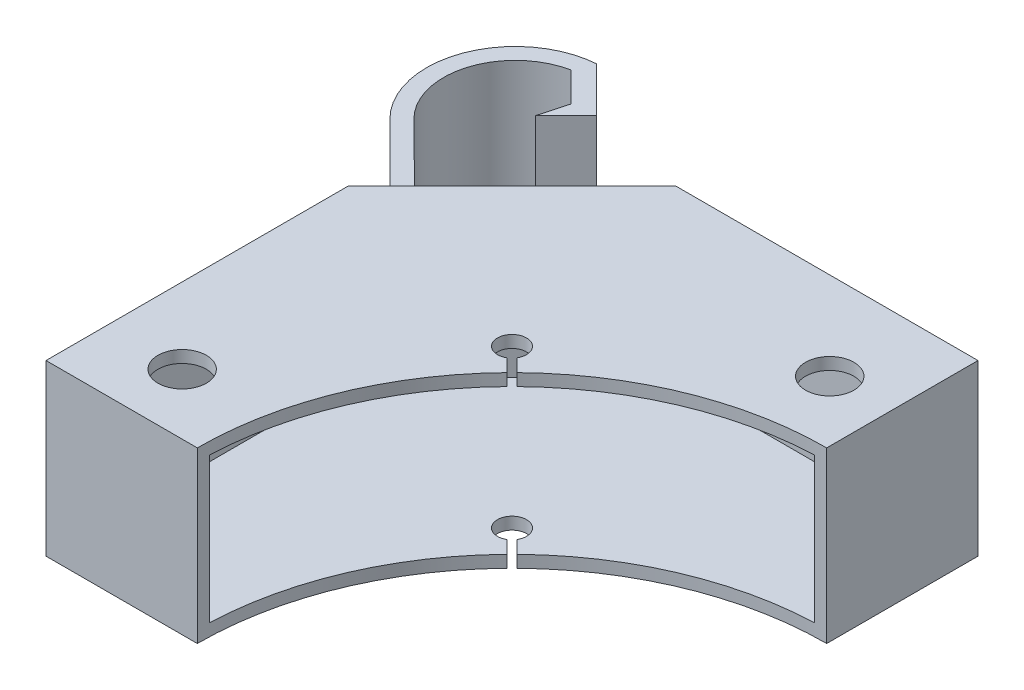
ISO-10303-21;
HEADER;
FILE_DESCRIPTION(('STEP AP214'),'2;1');
FILE_NAME('part.step','',(''),(''),'','','');
FILE_SCHEMA(('AUTOMOTIVE_DESIGN { 1 0 10303 214 1 1 1 1 }'));
ENDSEC;
DATA;
#1=APPLICATION_CONTEXT('core data for automotive mechanical design processes');
#2=APPLICATION_PROTOCOL_DEFINITION('international standard','automotive_design',2000,#1);
#3=PRODUCT_CONTEXT('',#1,'mechanical');
#4=PRODUCT('Part','Part','',(#3));
#5=PRODUCT_RELATED_PRODUCT_CATEGORY('part','',(#4));
#6=PRODUCT_DEFINITION_FORMATION('','',#4);
#7=PRODUCT_DEFINITION_CONTEXT('part definition',#1,'design');
#8=PRODUCT_DEFINITION('design','',#6,#7);
#9=PRODUCT_DEFINITION_SHAPE('','',#8);
#10=(LENGTH_UNIT() NAMED_UNIT(*) SI_UNIT(.MILLI.,.METRE.));
#11=(NAMED_UNIT(*) PLANE_ANGLE_UNIT() SI_UNIT($,.RADIAN.));
#12=(NAMED_UNIT(*) SI_UNIT($,.STERADIAN.) SOLID_ANGLE_UNIT());
#13=UNCERTAINTY_MEASURE_WITH_UNIT(LENGTH_MEASURE(1.E-05),#10,'distance_accuracy_value','');
#14=(GEOMETRIC_REPRESENTATION_CONTEXT(3) GLOBAL_UNCERTAINTY_ASSIGNED_CONTEXT((#13)) GLOBAL_UNIT_ASSIGNED_CONTEXT((#10,
#11,#12)) REPRESENTATION_CONTEXT('',''));
#15=CARTESIAN_POINT('',(0.,0.,0.));
#16=DIRECTION('',(0.,0.,1.));
#17=DIRECTION('',(1.,0.,0.));
#18=AXIS2_PLACEMENT_3D('',#15,#16,#17);
#19=CARTESIAN_POINT('',(-20.50609665441,27.,-71.9203102167828));
#20=DIRECTION('',(0.,-1.,0.));
#21=DIRECTION('',(0.,0.,-1.));
#22=AXIS2_PLACEMENT_3D('',#19,#20,#21);
#23=PLANE('',#22);
#24=DIRECTION('',(0.71037370162736,0.,0.703824696949633));
#25=VECTOR('',#24,1.);
#26=CARTESIAN_POINT('',(-15.8873615053741,27.,-76.5820221443081));
#27=LINE('',#26,#25);
#28=CARTESIAN_POINT('',(-5.15351595946739,27.,-65.9471329709827));
#29=VERTEX_POINT('',#28);
#30=CARTESIAN_POINT('',(5.44566595344239,27.,-55.4456659534424));
#31=VERTEX_POINT('',#30);
#32=EDGE_CURVE('E273',#29,#31,#27,.T.);
#33=ORIENTED_EDGE('',*,*,#32,.F.);
#34=CARTESIAN_POINT('',(3.17640056931442,27.,-74.3545583773991));
#35=DIRECTION('',(0.,-1.,0.));
#36=DIRECTION('',(0.,0.,-1.));
#37=AXIS2_PLACEMENT_3D('',#34,#35,#36);
#38=CIRCLE('',#37,11.8352148835975);
#39=CARTESIAN_POINT('',(0.807292373089444,27.,-85.9502316090622));
#40=VERTEX_POINT('',#39);
#41=EDGE_CURVE('E269',#40,#29,#38,.F.);
#42=ORIENTED_EDGE('',*,*,#41,.F.);
#43=DIRECTION('',(-0.707106781186548,0.,-0.707106781186547));
#44=VECTOR('',#43,1.);
#45=CARTESIAN_POINT('',(-2.83444144452059,27.,-89.5919654266722));
#46=LINE('',#45,#44);
#47=CARTESIAN_POINT('',(5.67104255263289,27.,-81.0864814295187));
#48=VERTEX_POINT('',#47);
#49=EDGE_CURVE('E265',#48,#40,#46,.T.);
#50=ORIENTED_EDGE('',*,*,#49,.F.);
#51=DIRECTION('',(0.265706176141184,0.,-0.964054058629717));
#52=VECTOR('',#51,1.);
#53=CARTESIAN_POINT('',(1.47498082783507,27.,-65.8620316451724));
#54=LINE('',#53,#52);
#55=CARTESIAN_POINT('',(4.41044873230969,27.,-76.512705213943));
#56=VERTEX_POINT('',#55);
#57=EDGE_CURVE('E258',#56,#48,#54,.T.);
#58=ORIENTED_EDGE('',*,*,#57,.F.);
#59=DIRECTION('',(-0.707106781186547,0.,0.707106781186548));
#60=VECTOR('',#59,1.);
#61=CARTESIAN_POINT('',(-10.3440214596303,27.,-61.758235022003));
#62=LINE('',#61,#60);
#63=CARTESIAN_POINT('',(9.4489540938188,27.,-81.5512105754521));
#64=VERTEX_POINT('',#63);
#65=EDGE_CURVE('E252',#64,#56,#62,.T.);
#66=ORIENTED_EDGE('',*,*,#65,.F.);
#67=DIRECTION('',(0.707106781186548,0.,0.707106781186547));
#68=VECTOR('',#67,1.);
#69=CARTESIAN_POINT('',(-0.713121100960917,27.,-91.7132857702318));
#70=LINE('',#69,#68);
#71=CARTESIAN_POINT('',(2.04781425632615,27.,-88.9523504129448));
#72=VERTEX_POINT('',#71);
#73=EDGE_CURVE('E231',#72,#64,#70,.T.);
#74=ORIENTED_EDGE('',*,*,#73,.F.);
#75=CARTESIAN_POINT('',(3.17640056931442,27.,-74.3545583773991));
#76=DIRECTION('',(0.,-1.,0.));
#77=DIRECTION('',(0.,0.,-1.));
#78=AXIS2_PLACEMENT_3D('',#75,#76,#77);
#79=CIRCLE('',#78,14.641353741335);
#80=CARTESIAN_POINT('',(-7.17659994693462,27.,-64.00155786115));
#81=VERTEX_POINT('',#80);
#82=EDGE_CURVE('E239',#81,#72,#79,.T.);
#83=ORIENTED_EDGE('',*,*,#82,.F.);
#84=DIRECTION('',(-0.707106781186547,0.,-0.707106781186548));
#85=VECTOR('',#84,1.);
#86=CARTESIAN_POINT('',(-17.8007244784887,27.,-74.6256823927041));
#87=LINE('',#86,#85);
#88=CARTESIAN_POINT('',(3.41247895710775,27.,-53.4124789571077));
#89=VERTEX_POINT('',#88);
#90=EDGE_CURVE('E247',#89,#81,#87,.T.);
#91=ORIENTED_EDGE('',*,*,#90,.F.);
#92=DIRECTION('',(0.707106781186543,0.,-0.707106781186551));
#93=VECTOR('',#92,1.);
#94=CARTESIAN_POINT('',(0.707106781186548,27.,-50.7071067811865));
#95=LINE('',#94,#93);
#96=EDGE_CURVE('E298',#89,#31,#95,.T.);
#97=ORIENTED_EDGE('',*,*,#96,.T.);
#98=EDGE_LOOP('',(#33,#42,#50,#58,#66,#74,#83,#91,#97));
#99=FACE_BOUND('',#98,.T.);
#100=ADVANCED_FACE('F37',(#99),#23,.F.);
#101=CARTESIAN_POINT('',(26.9999999999998,28.,-77.));
#102=DIRECTION('',(0.707106781186552,0.,0.707106781186543));
#103=DIRECTION('',(0.707106781186543,0.,-0.707106781186552));
#104=AXIS2_PLACEMENT_3D('',#101,#102,#103);
#105=PLANE('',#104);
#106=DIRECTION('',(0.,1.,0.));
#107=VECTOR('',#106,1.);
#108=CARTESIAN_POINT('',(3.41247895710775,-3.,-53.4124789571077));
#109=LINE('',#108,#107);
#110=CARTESIAN_POINT('',(3.41247895710775,1.,-53.4124789571077));
#111=VERTEX_POINT('',#110);
#112=EDGE_CURVE('E299',#111,#89,#109,.T.);
#113=ORIENTED_EDGE('',*,*,#112,.F.);
#114=DIRECTION('',(-0.707106781186543,0.,0.707106781186551));
#115=VECTOR('',#114,1.);
#116=CARTESIAN_POINT('',(26.2928932188132,1.,-76.2928932188134));
#117=LINE('',#116,#115);
#118=CARTESIAN_POINT('',(5.44566595344239,1.,-55.4456659534424));
#119=VERTEX_POINT('',#118);
#120=EDGE_CURVE('E302',#119,#111,#117,.T.);
#121=ORIENTED_EDGE('',*,*,#120,.F.);
#122=DIRECTION('',(0.,1.,0.));
#123=VECTOR('',#122,1.);
#124=CARTESIAN_POINT('',(5.44566595344239,-3.,-55.4456659534424));
#125=LINE('',#124,#123);
#126=EDGE_CURVE('E304',#119,#31,#125,.T.);
#127=ORIENTED_EDGE('',*,*,#126,.T.);
#128=ORIENTED_EDGE('',*,*,#96,.F.);
#129=EDGE_LOOP('',(#113,#121,#127,#128));
#130=FACE_BOUND('',#129,.T.);
#131=DIRECTION('',(-0.707106781186543,0.,0.707106781186552));
#132=VECTOR('',#131,1.);
#133=CARTESIAN_POINT('',(26.9999999999998,0.,-77.));
#134=LINE('',#133,#132);
#135=CARTESIAN_POINT('',(26.9999999999998,0.,-77.));
#136=VERTEX_POINT('',#135);
#137=CARTESIAN_POINT('',(0.,0.,-49.9999999999999));
#138=VERTEX_POINT('',#137);
#139=EDGE_CURVE('E435',#136,#138,#134,.T.);
#140=ORIENTED_EDGE('',*,*,#139,.T.);
#141=DIRECTION('',(0.,-1.,0.));
#142=VECTOR('',#141,1.);
#143=CARTESIAN_POINT('',(0.,28.,-49.9999999999999));
#144=LINE('',#143,#142);
#145=CARTESIAN_POINT('',(0.,28.,-49.9999999999999));
#146=VERTEX_POINT('',#145);
#147=EDGE_CURVE('E440',#146,#138,#144,.T.);
#148=ORIENTED_EDGE('',*,*,#147,.F.);
#149=DIRECTION('',(-0.707106781186543,0.,0.707106781186552));
#150=VECTOR('',#149,1.);
#151=CARTESIAN_POINT('',(26.9999999999998,28.,-77.));
#152=LINE('',#151,#150);
#153=CARTESIAN_POINT('',(26.9999999999998,28.,-77.));
#154=VERTEX_POINT('',#153);
#155=EDGE_CURVE('E410',#154,#146,#152,.T.);
#156=ORIENTED_EDGE('',*,*,#155,.F.);
#157=DIRECTION('',(0.,-1.,0.));
#158=VECTOR('',#157,1.);
#159=CARTESIAN_POINT('',(26.9999999999998,28.,-77.));
#160=LINE('',#159,#158);
#161=EDGE_CURVE('E443',#154,#136,#160,.T.);
#162=ORIENTED_EDGE('',*,*,#161,.T.);
#163=EDGE_LOOP('',(#140,#148,#156,#162));
#164=FACE_BOUND('',#163,.T.);
#165=ADVANCED_FACE('F528',(#130,#164),#105,.F.);
#166=CARTESIAN_POINT('',(39.808631068381,28.,-36.3428407941951));
#167=DIRECTION('',(-0.707106781186547,0.,0.707106781186547));
#168=DIRECTION('',(0.707106781186548,0.,0.707106781186548));
#169=AXIS2_PLACEMENT_3D('',#166,#167,#168);
#170=PLANE('',#169);
#171=DIRECTION('',(-0.707106781186548,0.,-0.707106781186548));
#172=VECTOR('',#171,1.);
#173=CARTESIAN_POINT('',(39.808631068381,2.,-36.3428407941951));
#174=LINE('',#173,#172);
#175=CARTESIAN_POINT('',(39.8086310683811,2.,-36.3428407941951));
#176=VERTEX_POINT('',#175);
#177=CARTESIAN_POINT('',(37.6873107248214,2.,-38.4641611377547));
#178=VERTEX_POINT('',#177);
#179=EDGE_CURVE('E328',#176,#178,#174,.T.);
#180=ORIENTED_EDGE('',*,*,#179,.F.);
#181=DIRECTION('',(0.,-1.,0.));
#182=VECTOR('',#181,1.);
#183=CARTESIAN_POINT('',(39.808631068381,28.,-36.3428407941951));
#184=LINE('',#183,#182);
#185=CARTESIAN_POINT('',(39.808631068381,0.,-36.3428407941951));
#186=VERTEX_POINT('',#185);
#187=EDGE_CURVE('E464',#176,#186,#184,.T.);
#188=ORIENTED_EDGE('',*,*,#187,.T.);
#189=DIRECTION('',(-0.707106781186548,0.,-0.707106781186548));
#190=VECTOR('',#189,1.);
#191=CARTESIAN_POINT('',(39.808631068381,0.,-36.3428407941951));
#192=LINE('',#191,#190);
#193=CARTESIAN_POINT('',(37.6873107248214,0.,-38.4641611377547));
#194=VERTEX_POINT('',#193);
#195=EDGE_CURVE('E420',#186,#194,#192,.T.);
#196=ORIENTED_EDGE('',*,*,#195,.T.);
#197=DIRECTION('',(0.,-1.,0.));
#198=VECTOR('',#197,1.);
#199=CARTESIAN_POINT('',(37.6873107248214,28.,-38.4641611377547));
#200=LINE('',#199,#198);
#201=EDGE_CURVE('E460',#178,#194,#200,.T.);
#202=ORIENTED_EDGE('',*,*,#201,.F.);
#203=EDGE_LOOP('',(#180,#188,#196,#202));
#204=FACE_BOUND('',#203,.T.);
#205=ADVANCED_FACE('F498',(#204),#170,.F.);
#206=CARTESIAN_POINT('',(36.4684071210178,28.,-40.5315928789821));
#207=DIRECTION('',(0.,-1.,0.));
#208=DIRECTION('',(0.,0.,-1.));
#209=AXIS2_PLACEMENT_3D('',#206,#207,#208);
#210=CYLINDRICAL_SURFACE('',#209,2.4);
#211=CARTESIAN_POINT('',(36.4684071210178,2.,-40.5315928789821));
#212=DIRECTION('',(0.,1.,0.));
#213=DIRECTION('',(0.,0.,1.));
#214=AXIS2_PLACEMENT_3D('',#211,#212,#213);
#215=CIRCLE('',#214,2.4);
#216=CARTESIAN_POINT('',(38.5358388622453,2.,-39.3126892751786));
#217=VERTEX_POINT('',#216);
#218=EDGE_CURVE('E332',#178,#217,#215,.F.);
#219=ORIENTED_EDGE('',*,*,#218,.F.);
#220=ORIENTED_EDGE('',*,*,#201,.T.);
#221=CARTESIAN_POINT('',(36.4684071210178,0.,-40.5315928789821));
#222=DIRECTION('',(0.,-1.,0.));
#223=DIRECTION('',(0.,0.,-1.));
#224=AXIS2_PLACEMENT_3D('',#221,#222,#223);
#225=CIRCLE('',#224,2.4);
#226=CARTESIAN_POINT('',(38.5358388622453,0.,-39.3126892751786));
#227=VERTEX_POINT('',#226);
#228=EDGE_CURVE('E423',#194,#227,#225,.T.);
#229=ORIENTED_EDGE('',*,*,#228,.T.);
#230=DIRECTION('',(0.,-1.,0.));
#231=VECTOR('',#230,1.);
#232=CARTESIAN_POINT('',(38.5358388622453,28.,-39.3126892751786));
#233=LINE('',#232,#231);
#234=EDGE_CURVE('E456',#217,#227,#233,.T.);
#235=ORIENTED_EDGE('',*,*,#234,.F.);
#236=EDGE_LOOP('',(#219,#220,#229,#235));
#237=FACE_BOUND('',#236,.T.);
#238=ADVANCED_FACE('F550',(#237),#210,.F.);
#239=CARTESIAN_POINT('',(40.6571592058049,28.,-37.1913689316189));
#240=DIRECTION('',(0.707106781186547,0.,-0.707106781186547));
#241=DIRECTION('',(-0.707106781186548,0.,-0.707106781186548));
#242=AXIS2_PLACEMENT_3D('',#239,#240,#241);
#243=PLANE('',#242);
#244=DIRECTION('',(0.707106781186548,0.,0.707106781186548));
#245=VECTOR('',#244,1.);
#246=CARTESIAN_POINT('',(40.6571592058049,2.,-37.1913689316189));
#247=LINE('',#246,#245);
#248=CARTESIAN_POINT('',(40.6571592058049,2.,-37.1913689316189));
#249=VERTEX_POINT('',#248);
#250=EDGE_CURVE('E334',#217,#249,#247,.T.);
#251=ORIENTED_EDGE('',*,*,#250,.F.);
#252=ORIENTED_EDGE('',*,*,#234,.T.);
#253=DIRECTION('',(0.707106781186548,0.,0.707106781186548));
#254=VECTOR('',#253,1.);
#255=CARTESIAN_POINT('',(40.6571592058049,0.,-37.1913689316189));
#256=LINE('',#255,#254);
#257=CARTESIAN_POINT('',(40.6571592058049,0.,-37.1913689316189));
#258=VERTEX_POINT('',#257);
#259=EDGE_CURVE('E426',#227,#258,#256,.T.);
#260=ORIENTED_EDGE('',*,*,#259,.T.);
#261=DIRECTION('',(0.,-1.,0.));
#262=VECTOR('',#261,1.);
#263=CARTESIAN_POINT('',(40.6571592058049,28.,-37.1913689316189));
#264=LINE('',#263,#262);
#265=EDGE_CURVE('E452',#249,#258,#264,.T.);
#266=ORIENTED_EDGE('',*,*,#265,.F.);
#267=EDGE_LOOP('',(#251,#252,#260,#266));
#268=FACE_BOUND('',#267,.T.);
#269=ADVANCED_FACE('F547',(#268),#243,.F.);
#270=CARTESIAN_POINT('',(77.,28.,0.));
#271=DIRECTION('',(0.,-1.,0.));
#272=DIRECTION('',(0.,0.,-1.));
#273=AXIS2_PLACEMENT_3D('',#270,#271,#272);
#274=CYLINDRICAL_SURFACE('',#273,52.);
#275=CARTESIAN_POINT('',(77.,26.,0.));
#276=DIRECTION('',(0.,1.,0.));
#277=DIRECTION('',(0.,0.,1.));
#278=AXIS2_PLACEMENT_3D('',#275,#276,#277);
#279=CIRCLE('',#278,52.);
#280=CARTESIAN_POINT('',(25.0384757729337,26.,-2.));
#281=VERTEX_POINT('',#280);
#282=CARTESIAN_POINT('',(39.8086310683811,26.,-36.3428407941951));
#283=VERTEX_POINT('',#282);
#284=EDGE_CURVE('E351',#281,#283,#279,.F.);
#285=ORIENTED_EDGE('',*,*,#284,.T.);
#286=CARTESIAN_POINT('',(39.808631068381,28.,-36.3428407941951));
#287=VERTEX_POINT('',#286);
#288=EDGE_CURVE('E465',#287,#283,#184,.T.);
#289=ORIENTED_EDGE('',*,*,#288,.F.);
#290=CARTESIAN_POINT('',(77.,28.,0.));
#291=DIRECTION('',(0.,-1.,0.));
#292=DIRECTION('',(0.,0.,1.));
#293=AXIS2_PLACEMENT_3D('',#290,#291,#292);
#294=CIRCLE('',#293,52.);
#295=CARTESIAN_POINT('',(25.,28.,0.));
#296=VERTEX_POINT('',#295);
#297=EDGE_CURVE('E395',#296,#287,#294,.T.);
#298=ORIENTED_EDGE('',*,*,#297,.F.);
#299=DIRECTION('',(0.,-1.,0.));
#300=VECTOR('',#299,1.);
#301=CARTESIAN_POINT('',(25.,28.,0.));
#302=LINE('',#301,#300);
#303=CARTESIAN_POINT('',(25.,0.,0.));
#304=VERTEX_POINT('',#303);
#305=EDGE_CURVE('E468',#296,#304,#302,.T.);
#306=ORIENTED_EDGE('',*,*,#305,.T.);
#307=CARTESIAN_POINT('',(77.,0.,0.));
#308=DIRECTION('',(0.,-1.,0.));
#309=DIRECTION('',(0.,0.,1.));
#310=AXIS2_PLACEMENT_3D('',#307,#308,#309);
#311=CIRCLE('',#310,52.);
#312=EDGE_CURVE('E417',#304,#186,#311,.T.);
#313=ORIENTED_EDGE('',*,*,#312,.T.);
#314=ORIENTED_EDGE('',*,*,#187,.F.);
#315=CARTESIAN_POINT('',(77.,2.,0.));
#316=DIRECTION('',(0.,1.,0.));
#317=DIRECTION('',(0.,0.,1.));
#318=AXIS2_PLACEMENT_3D('',#315,#316,#317);
#319=CIRCLE('',#318,52.);
#320=CARTESIAN_POINT('',(25.0384757729337,2.,-2.));
#321=VERTEX_POINT('',#320);
#322=EDGE_CURVE('E349',#321,#176,#319,.F.);
#323=ORIENTED_EDGE('',*,*,#322,.F.);
#324=DIRECTION('',(0.,-1.,0.));
#325=VECTOR('',#324,1.);
#326=CARTESIAN_POINT('',(25.0384757729337,26.,-2.));
#327=LINE('',#326,#325);
#328=EDGE_CURVE('E383',#281,#321,#327,.T.);
#329=ORIENTED_EDGE('',*,*,#328,.F.);
#330=EDGE_LOOP('',(#285,#289,#298,#306,#313,#314,#323,#329));
#331=FACE_BOUND('',#330,.T.);
#332=ADVANCED_FACE('F481',(#331),#274,.F.);
#333=CARTESIAN_POINT('',(77.,28.,0.));
#334=DIRECTION('',(0.,-1.,0.));
#335=DIRECTION('',(0.,0.,-1.));
#336=AXIS2_PLACEMENT_3D('',#333,#334,#335);
#337=CYLINDRICAL_SURFACE('',#336,52.);
#338=CARTESIAN_POINT('',(40.6571592058049,28.,-37.1913689316189));
#339=VERTEX_POINT('',#338);
#340=CARTESIAN_POINT('',(40.6571592058049,26.,-37.1913689316189));
#341=VERTEX_POINT('',#340);
#342=EDGE_CURVE('E453',#339,#341,#264,.T.);
#343=ORIENTED_EDGE('',*,*,#342,.T.);
#344=CARTESIAN_POINT('',(77.,26.,0.));
#345=DIRECTION('',(0.,1.,0.));
#346=DIRECTION('',(0.,0.,1.));
#347=AXIS2_PLACEMENT_3D('',#344,#345,#346);
#348=CIRCLE('',#347,52.);
#349=CARTESIAN_POINT('',(75.,26.,-51.9615242270663));
#350=VERTEX_POINT('',#349);
#351=EDGE_CURVE('E382',#341,#350,#348,.F.);
#352=ORIENTED_EDGE('',*,*,#351,.T.);
#353=DIRECTION('',(0.,-1.,0.));
#354=VECTOR('',#353,1.);
#355=CARTESIAN_POINT('',(75.,26.,-51.9615242270663));
#356=LINE('',#355,#354);
#357=CARTESIAN_POINT('',(75.,2.,-51.9615242270663));
#358=VERTEX_POINT('',#357);
#359=EDGE_CURVE('E378',#350,#358,#356,.T.);
#360=ORIENTED_EDGE('',*,*,#359,.T.);
#361=CARTESIAN_POINT('',(77.,2.,0.));
#362=DIRECTION('',(0.,1.,0.));
#363=DIRECTION('',(0.,0.,1.));
#364=AXIS2_PLACEMENT_3D('',#361,#362,#363);
#365=CIRCLE('',#364,52.);
#366=EDGE_CURVE('E380',#249,#358,#365,.F.);
#367=ORIENTED_EDGE('',*,*,#366,.F.);
#368=ORIENTED_EDGE('',*,*,#265,.T.);
#369=CARTESIAN_POINT('',(77.,0.,0.));
#370=DIRECTION('',(0.,-1.,0.));
#371=DIRECTION('',(0.,0.,-1.));
#372=AXIS2_PLACEMENT_3D('',#369,#370,#371);
#373=CIRCLE('',#372,52.);
#374=CARTESIAN_POINT('',(77.,0.,-52.));
#375=VERTEX_POINT('',#374);
#376=EDGE_CURVE('E429',#258,#375,#373,.T.);
#377=ORIENTED_EDGE('',*,*,#376,.T.);
#378=DIRECTION('',(0.,-1.,0.));
#379=VECTOR('',#378,1.);
#380=CARTESIAN_POINT('',(77.,28.,-52.));
#381=LINE('',#380,#379);
#382=CARTESIAN_POINT('',(77.,28.,-52.));
#383=VERTEX_POINT('',#382);
#384=EDGE_CURVE('E449',#383,#375,#381,.T.);
#385=ORIENTED_EDGE('',*,*,#384,.F.);
#386=CARTESIAN_POINT('',(77.,28.,0.));
#387=DIRECTION('',(0.,-1.,0.));
#388=DIRECTION('',(0.,0.,-1.));
#389=AXIS2_PLACEMENT_3D('',#386,#387,#388);
#390=CIRCLE('',#389,52.);
#391=EDGE_CURVE('E404',#339,#383,#390,.T.);
#392=ORIENTED_EDGE('',*,*,#391,.F.);
#393=EDGE_LOOP('',(#343,#352,#360,#367,#368,#377,#385,#392));
#394=FACE_BOUND('',#393,.T.);
#395=ADVANCED_FACE('F543',(#394),#337,.F.);
#396=CARTESIAN_POINT('',(0.,28.,0.));
#397=DIRECTION('',(0.,0.,-1.));
#398=DIRECTION('',(-1.,0.,0.));
#399=AXIS2_PLACEMENT_3D('',#396,#397,#398);
#400=PLANE('',#399);
#401=DIRECTION('',(1.,0.,0.));
#402=VECTOR('',#401,1.);
#403=CARTESIAN_POINT('',(0.,0.,0.));
#404=LINE('',#403,#402);
#405=CARTESIAN_POINT('',(0.,0.,0.));
#406=VERTEX_POINT('',#405);
#407=EDGE_CURVE('E385',#406,#304,#404,.T.);
#408=ORIENTED_EDGE('',*,*,#407,.T.);
#409=ORIENTED_EDGE('',*,*,#305,.F.);
#410=DIRECTION('',(1.,0.,0.));
#411=VECTOR('',#410,1.);
#412=CARTESIAN_POINT('',(0.,28.,0.));
#413=LINE('',#412,#411);
#414=CARTESIAN_POINT('',(0.,28.,0.));
#415=VERTEX_POINT('',#414);
#416=EDGE_CURVE('E392',#415,#296,#413,.T.);
#417=ORIENTED_EDGE('',*,*,#416,.F.);
#418=DIRECTION('',(0.,-1.,0.));
#419=VECTOR('',#418,1.);
#420=CARTESIAN_POINT('',(0.,28.,0.));
#421=LINE('',#420,#419);
#422=EDGE_CURVE('E414',#415,#406,#421,.T.);
#423=ORIENTED_EDGE('',*,*,#422,.T.);
#424=EDGE_LOOP('',(#408,#409,#417,#423));
#425=FACE_BOUND('',#424,.T.);
#426=ADVANCED_FACE('F39',(#425),#400,.F.);
#427=ORIENTED_EDGE('',*,*,#288,.T.);
#428=DIRECTION('',(-0.707106781186548,0.,-0.707106781186548));
#429=VECTOR('',#428,1.);
#430=CARTESIAN_POINT('',(39.808631068381,26.,-36.3428407941951));
#431=LINE('',#430,#429);
#432=CARTESIAN_POINT('',(37.6873107248214,26.,-38.4641611377547));
#433=VERTEX_POINT('',#432);
#434=EDGE_CURVE('E337',#283,#433,#431,.T.);
#435=ORIENTED_EDGE('',*,*,#434,.T.);
#436=CARTESIAN_POINT('',(37.6873107248214,28.,-38.4641611377547));
#437=VERTEX_POINT('',#436);
#438=EDGE_CURVE('E461',#437,#433,#200,.T.);
#439=ORIENTED_EDGE('',*,*,#438,.F.);
#440=DIRECTION('',(-0.707106781186548,0.,-0.707106781186548));
#441=VECTOR('',#440,1.);
#442=CARTESIAN_POINT('',(39.808631068381,28.,-36.3428407941951));
#443=LINE('',#442,#441);
#444=EDGE_CURVE('E398',#287,#437,#443,.T.);
#445=ORIENTED_EDGE('',*,*,#444,.F.);
#446=EDGE_LOOP('',(#427,#435,#439,#445));
#447=FACE_BOUND('',#446,.T.);
#448=ADVANCED_FACE('F517',(#447),#170,.F.);
#449=ORIENTED_EDGE('',*,*,#438,.T.);
#450=CARTESIAN_POINT('',(36.4684071210178,26.,-40.5315928789821));
#451=DIRECTION('',(0.,1.,0.));
#452=DIRECTION('',(0.,0.,1.));
#453=AXIS2_PLACEMENT_3D('',#450,#451,#452);
#454=CIRCLE('',#453,2.4);
#455=CARTESIAN_POINT('',(38.5358388622453,26.,-39.3126892751786));
#456=VERTEX_POINT('',#455);
#457=EDGE_CURVE('E340',#433,#456,#454,.F.);
#458=ORIENTED_EDGE('',*,*,#457,.T.);
#459=CARTESIAN_POINT('',(38.5358388622453,28.,-39.3126892751786));
#460=VERTEX_POINT('',#459);
#461=EDGE_CURVE('E457',#460,#456,#233,.T.);
#462=ORIENTED_EDGE('',*,*,#461,.F.);
#463=CARTESIAN_POINT('',(36.4684071210178,28.,-40.5315928789821));
#464=DIRECTION('',(0.,-1.,0.));
#465=DIRECTION('',(0.,0.,-1.));
#466=AXIS2_PLACEMENT_3D('',#463,#464,#465);
#467=CIRCLE('',#466,2.4);
#468=EDGE_CURVE('E400',#437,#460,#467,.T.);
#469=ORIENTED_EDGE('',*,*,#468,.F.);
#470=EDGE_LOOP('',(#449,#458,#462,#469));
#471=FACE_BOUND('',#470,.T.);
#472=ADVANCED_FACE('F563',(#471),#210,.F.);
#473=ORIENTED_EDGE('',*,*,#461,.T.);
#474=DIRECTION('',(0.707106781186548,0.,0.707106781186548));
#475=VECTOR('',#474,1.);
#476=CARTESIAN_POINT('',(40.6571592058049,26.,-37.1913689316189));
#477=LINE('',#476,#475);
#478=EDGE_CURVE('E343',#456,#341,#477,.T.);
#479=ORIENTED_EDGE('',*,*,#478,.T.);
#480=ORIENTED_EDGE('',*,*,#342,.F.);
#481=DIRECTION('',(0.707106781186548,0.,0.707106781186548));
#482=VECTOR('',#481,1.);
#483=CARTESIAN_POINT('',(40.6571592058049,28.,-37.1913689316189));
#484=LINE('',#483,#482);
#485=EDGE_CURVE('E402',#460,#339,#484,.T.);
#486=ORIENTED_EDGE('',*,*,#485,.F.);
#487=EDGE_LOOP('',(#473,#479,#480,#486));
#488=FACE_BOUND('',#487,.T.);
#489=ADVANCED_FACE('F560',(#488),#243,.F.);
#490=CARTESIAN_POINT('',(77.,28.,-77.));
#491=DIRECTION('',(-1.,0.,0.));
#492=DIRECTION('',(0.,0.,1.));
#493=AXIS2_PLACEMENT_3D('',#490,#491,#492);
#494=PLANE('',#493);
#495=DIRECTION('',(0.,0.,-1.));
#496=VECTOR('',#495,1.);
#497=CARTESIAN_POINT('',(77.,0.,-77.));
#498=LINE('',#497,#496);
#499=CARTESIAN_POINT('',(77.,0.,-77.));
#500=VERTEX_POINT('',#499);
#501=EDGE_CURVE('E431',#375,#500,#498,.T.);
#502=ORIENTED_EDGE('',*,*,#501,.T.);
#503=DIRECTION('',(0.,-1.,0.));
#504=VECTOR('',#503,1.);
#505=CARTESIAN_POINT('',(77.,28.,-77.));
#506=LINE('',#505,#504);
#507=CARTESIAN_POINT('',(77.,28.,-77.));
#508=VERTEX_POINT('',#507);
#509=EDGE_CURVE('E446',#508,#500,#506,.T.);
#510=ORIENTED_EDGE('',*,*,#509,.F.);
#511=DIRECTION('',(0.,0.,-1.));
#512=VECTOR('',#511,1.);
#513=CARTESIAN_POINT('',(77.,28.,-77.));
#514=LINE('',#513,#512);
#515=EDGE_CURVE('E406',#383,#508,#514,.T.);
#516=ORIENTED_EDGE('',*,*,#515,.F.);
#517=ORIENTED_EDGE('',*,*,#384,.T.);
#518=EDGE_LOOP('',(#502,#510,#516,#517));
#519=FACE_BOUND('',#518,.T.);
#520=ADVANCED_FACE('F539',(#519),#494,.F.);
#521=CARTESIAN_POINT('',(26.9999999999998,28.,-77.));
#522=DIRECTION('',(0.,0.,1.));
#523=DIRECTION('',(1.,0.,0.));
#524=AXIS2_PLACEMENT_3D('',#521,#522,#523);
#525=PLANE('',#524);
#526=DIRECTION('',(-1.,0.,0.));
#527=VECTOR('',#526,1.);
#528=CARTESIAN_POINT('',(26.9999999999998,0.,-77.));
#529=LINE('',#528,#527);
#530=EDGE_CURVE('E433',#500,#136,#529,.T.);
#531=ORIENTED_EDGE('',*,*,#530,.T.);
#532=ORIENTED_EDGE('',*,*,#161,.F.);
#533=DIRECTION('',(-1.,0.,0.));
#534=VECTOR('',#533,1.);
#535=CARTESIAN_POINT('',(26.9999999999998,28.,-77.));
#536=LINE('',#535,#534);
#537=EDGE_CURVE('E408',#508,#154,#536,.T.);
#538=ORIENTED_EDGE('',*,*,#537,.F.);
#539=ORIENTED_EDGE('',*,*,#509,.T.);
#540=EDGE_LOOP('',(#531,#532,#538,#539));
#541=FACE_BOUND('',#540,.T.);
#542=ADVANCED_FACE('F534',(#541),#525,.F.);
#543=CARTESIAN_POINT('',(0.,28.,0.));
#544=DIRECTION('',(1.,0.,0.));
#545=DIRECTION('',(0.,0.,-1.));
#546=AXIS2_PLACEMENT_3D('',#543,#544,#545);
#547=PLANE('',#546);
#548=DIRECTION('',(0.,0.,1.));
#549=VECTOR('',#548,1.);
#550=CARTESIAN_POINT('',(0.,0.,0.));
#551=LINE('',#550,#549);
#552=EDGE_CURVE('E396',#138,#406,#551,.T.);
#553=ORIENTED_EDGE('',*,*,#552,.T.);
#554=ORIENTED_EDGE('',*,*,#422,.F.);
#555=DIRECTION('',(0.,0.,1.));
#556=VECTOR('',#555,1.);
#557=CARTESIAN_POINT('',(0.,28.,0.));
#558=LINE('',#557,#556);
#559=EDGE_CURVE('E412',#146,#415,#558,.T.);
#560=ORIENTED_EDGE('',*,*,#559,.F.);
#561=ORIENTED_EDGE('',*,*,#147,.T.);
#562=EDGE_LOOP('',(#553,#554,#560,#561));
#563=FACE_BOUND('',#562,.T.);
#564=ADVANCED_FACE('F526',(#563),#547,.F.);
#565=CARTESIAN_POINT('',(77.,28.,0.));
#566=DIRECTION('',(0.,1.,0.));
#567=DIRECTION('',(0.,0.,1.));
#568=AXIS2_PLACEMENT_3D('',#565,#566,#567);
#569=PLANE('',#568);
#570=CARTESIAN_POINT('',(12.5,28.,-10.));
#571=DIRECTION('',(0.,1.,0.));
#572=DIRECTION('',(0.,0.,1.));
#573=AXIS2_PLACEMENT_3D('',#570,#571,#572);
#574=CIRCLE('',#573,4.);
#575=CARTESIAN_POINT('',(12.5,28.,-6.));
#576=VERTEX_POINT('',#575);
#577=EDGE_CURVE('E318',#576,#576,#574,.T.);
#578=ORIENTED_EDGE('',*,*,#577,.F.);
#579=EDGE_LOOP('',(#578));
#580=FACE_BOUND('',#579,.T.);
#581=CARTESIAN_POINT('',(67.,28.,-62.5));
#582=DIRECTION('',(0.,1.,0.));
#583=DIRECTION('',(0.,0.,1.));
#584=AXIS2_PLACEMENT_3D('',#581,#582,#583);
#585=CIRCLE('',#584,4.00000000000001);
#586=CARTESIAN_POINT('',(67.,28.,-58.5));
#587=VERTEX_POINT('',#586);
#588=EDGE_CURVE('E322',#587,#587,#585,.T.);
#589=ORIENTED_EDGE('',*,*,#588,.F.);
#590=EDGE_LOOP('',(#589));
#591=FACE_BOUND('',#590,.T.);
#592=ORIENTED_EDGE('',*,*,#416,.T.);
#593=ORIENTED_EDGE('',*,*,#297,.T.);
#594=ORIENTED_EDGE('',*,*,#444,.T.);
#595=ORIENTED_EDGE('',*,*,#468,.T.);
#596=ORIENTED_EDGE('',*,*,#485,.T.);
#597=ORIENTED_EDGE('',*,*,#391,.T.);
#598=ORIENTED_EDGE('',*,*,#515,.T.);
#599=ORIENTED_EDGE('',*,*,#537,.T.);
#600=ORIENTED_EDGE('',*,*,#155,.T.);
#601=ORIENTED_EDGE('',*,*,#559,.T.);
#602=EDGE_LOOP('',(#592,#593,#594,#595,#596,#597,#598,#599,#600,#601));
#603=FACE_BOUND('',#602,.T.);
#604=ADVANCED_FACE('F520',(#580,#591,#603),#569,.T.);
#605=CARTESIAN_POINT('',(77.,0.,0.));
#606=DIRECTION('',(0.,1.,0.));
#607=DIRECTION('',(0.,0.,1.));
#608=AXIS2_PLACEMENT_3D('',#605,#606,#607);
#609=PLANE('',#608);
#610=ORIENTED_EDGE('',*,*,#407,.F.);
#611=ORIENTED_EDGE('',*,*,#552,.F.);
#612=ORIENTED_EDGE('',*,*,#139,.F.);
#613=ORIENTED_EDGE('',*,*,#530,.F.);
#614=ORIENTED_EDGE('',*,*,#501,.F.);
#615=ORIENTED_EDGE('',*,*,#376,.F.);
#616=ORIENTED_EDGE('',*,*,#259,.F.);
#617=ORIENTED_EDGE('',*,*,#228,.F.);
#618=ORIENTED_EDGE('',*,*,#195,.F.);
#619=ORIENTED_EDGE('',*,*,#312,.F.);
#620=EDGE_LOOP('',(#610,#611,#612,#613,#614,#615,#616,#617,#618,#619));
#621=FACE_BOUND('',#620,.T.);
#622=ADVANCED_FACE('F491',(#621),#609,.F.);
#623=CARTESIAN_POINT('',(0.,28.,-2.));
#624=DIRECTION('',(0.,0.,-1.));
#625=DIRECTION('',(-1.,0.,0.));
#626=AXIS2_PLACEMENT_3D('',#623,#624,#625);
#627=PLANE('',#626);
#628=DIRECTION('',(1.,0.,0.));
#629=VECTOR('',#628,1.);
#630=CARTESIAN_POINT('',(0.,2.,-2.));
#631=LINE('',#630,#629);
#632=CARTESIAN_POINT('',(2.,2.,-2.));
#633=VERTEX_POINT('',#632);
#634=EDGE_CURVE('E346',#633,#321,#631,.T.);
#635=ORIENTED_EDGE('',*,*,#634,.F.);
#636=DIRECTION('',(0.,-1.,0.));
#637=VECTOR('',#636,1.);
#638=CARTESIAN_POINT('',(2.,28.,-2.));
#639=LINE('',#638,#637);
#640=CARTESIAN_POINT('',(2.,26.,-2.));
#641=VERTEX_POINT('',#640);
#642=EDGE_CURVE('E353',#641,#633,#639,.T.);
#643=ORIENTED_EDGE('',*,*,#642,.F.);
#644=DIRECTION('',(1.,0.,0.));
#645=VECTOR('',#644,1.);
#646=CARTESIAN_POINT('',(0.,26.,-2.));
#647=LINE('',#646,#645);
#648=EDGE_CURVE('E60',#641,#281,#647,.T.);
#649=ORIENTED_EDGE('',*,*,#648,.T.);
#650=ORIENTED_EDGE('',*,*,#328,.T.);
#651=EDGE_LOOP('',(#635,#643,#649,#650));
#652=FACE_BOUND('',#651,.T.);
#653=ADVANCED_FACE('F506',(#652),#627,.T.);
#654=CARTESIAN_POINT('',(75.,28.,-77.));
#655=DIRECTION('',(-1.,0.,0.));
#656=DIRECTION('',(0.,0.,1.));
#657=AXIS2_PLACEMENT_3D('',#654,#655,#656);
#658=PLANE('',#657);
#659=DIRECTION('',(0.,0.,-1.));
#660=VECTOR('',#659,1.);
#661=CARTESIAN_POINT('',(75.,2.,-77.));
#662=LINE('',#661,#660);
#663=CARTESIAN_POINT('',(75.,2.,-75.));
#664=VERTEX_POINT('',#663);
#665=EDGE_CURVE('E373',#358,#664,#662,.T.);
#666=ORIENTED_EDGE('',*,*,#665,.F.);
#667=ORIENTED_EDGE('',*,*,#359,.F.);
#668=DIRECTION('',(0.,0.,-1.));
#669=VECTOR('',#668,1.);
#670=CARTESIAN_POINT('',(75.,26.,-77.));
#671=LINE('',#670,#669);
#672=CARTESIAN_POINT('',(75.,26.,-75.));
#673=VERTEX_POINT('',#672);
#674=EDGE_CURVE('E375',#350,#673,#671,.T.);
#675=ORIENTED_EDGE('',*,*,#674,.T.);
#676=DIRECTION('',(0.,-1.,0.));
#677=VECTOR('',#676,1.);
#678=CARTESIAN_POINT('',(75.,28.,-75.));
#679=LINE('',#678,#677);
#680=EDGE_CURVE('E371',#673,#664,#679,.T.);
#681=ORIENTED_EDGE('',*,*,#680,.T.);
#682=EDGE_LOOP('',(#666,#667,#675,#681));
#683=FACE_BOUND('',#682,.T.);
#684=ADVANCED_FACE('F554',(#683),#658,.T.);
#685=CARTESIAN_POINT('',(26.9999999999998,28.,-75.));
#686=DIRECTION('',(0.,0.,1.));
#687=DIRECTION('',(1.,0.,0.));
#688=AXIS2_PLACEMENT_3D('',#685,#686,#687);
#689=PLANE('',#688);
#690=DIRECTION('',(-1.,0.,0.));
#691=VECTOR('',#690,1.);
#692=CARTESIAN_POINT('',(26.9999999999998,2.,-75.));
#693=LINE('',#692,#691);
#694=CARTESIAN_POINT('',(27.828427124746,2.,-75.));
#695=VERTEX_POINT('',#694);
#696=EDGE_CURVE('E366',#664,#695,#693,.T.);
#697=ORIENTED_EDGE('',*,*,#696,.F.);
#698=ORIENTED_EDGE('',*,*,#680,.F.);
#699=DIRECTION('',(-1.,0.,0.));
#700=VECTOR('',#699,1.);
#701=CARTESIAN_POINT('',(26.9999999999998,26.,-75.));
#702=LINE('',#701,#700);
#703=CARTESIAN_POINT('',(27.828427124746,26.,-75.));
#704=VERTEX_POINT('',#703);
#705=EDGE_CURVE('E368',#673,#704,#702,.T.);
#706=ORIENTED_EDGE('',*,*,#705,.T.);
#707=DIRECTION('',(0.,-1.,0.));
#708=VECTOR('',#707,1.);
#709=CARTESIAN_POINT('',(27.828427124746,28.,-75.));
#710=LINE('',#709,#708);
#711=EDGE_CURVE('E364',#704,#695,#710,.T.);
#712=ORIENTED_EDGE('',*,*,#711,.T.);
#713=EDGE_LOOP('',(#697,#698,#706,#712));
#714=FACE_BOUND('',#713,.T.);
#715=ADVANCED_FACE('F595',(#714),#689,.T.);
#716=CARTESIAN_POINT('',(28.4142135623729,28.,-75.5857864376269));
#717=DIRECTION('',(0.707106781186552,0.,0.707106781186543));
#718=DIRECTION('',(0.707106781186543,0.,-0.707106781186552));
#719=AXIS2_PLACEMENT_3D('',#716,#717,#718);
#720=PLANE('',#719);
#721=DIRECTION('',(-0.707106781186543,0.,0.707106781186552));
#722=VECTOR('',#721,1.);
#723=CARTESIAN_POINT('',(28.4142135623729,2.,-75.5857864376269));
#724=LINE('',#723,#722);
#725=CARTESIAN_POINT('',(2.,2.,-49.1715728752537));
#726=VERTEX_POINT('',#725);
#727=EDGE_CURVE('E359',#695,#726,#724,.T.);
#728=ORIENTED_EDGE('',*,*,#727,.F.);
#729=ORIENTED_EDGE('',*,*,#711,.F.);
#730=DIRECTION('',(-0.707106781186543,0.,0.707106781186552));
#731=VECTOR('',#730,1.);
#732=CARTESIAN_POINT('',(28.4142135623729,26.,-75.5857864376269));
#733=LINE('',#732,#731);
#734=CARTESIAN_POINT('',(2.,26.,-49.1715728752537));
#735=VERTEX_POINT('',#734);
#736=EDGE_CURVE('E361',#704,#735,#733,.T.);
#737=ORIENTED_EDGE('',*,*,#736,.T.);
#738=DIRECTION('',(0.,-1.,0.));
#739=VECTOR('',#738,1.);
#740=CARTESIAN_POINT('',(2.,28.,-49.1715728752537));
#741=LINE('',#740,#739);
#742=EDGE_CURVE('E356',#735,#726,#741,.T.);
#743=ORIENTED_EDGE('',*,*,#742,.T.);
#744=EDGE_LOOP('',(#728,#729,#737,#743));
#745=FACE_BOUND('',#744,.T.);
#746=ADVANCED_FACE('F598',(#745),#720,.T.);
#747=CARTESIAN_POINT('',(2.,28.,0.));
#748=DIRECTION('',(1.,0.,0.));
#749=DIRECTION('',(0.,0.,-1.));
#750=AXIS2_PLACEMENT_3D('',#747,#748,#749);
#751=PLANE('',#750);
#752=DIRECTION('',(0.,0.,1.));
#753=VECTOR('',#752,1.);
#754=CARTESIAN_POINT('',(2.,2.,0.));
#755=LINE('',#754,#753);
#756=EDGE_CURVE('E352',#726,#633,#755,.T.);
#757=ORIENTED_EDGE('',*,*,#756,.F.);
#758=ORIENTED_EDGE('',*,*,#742,.F.);
#759=DIRECTION('',(0.,0.,1.));
#760=VECTOR('',#759,1.);
#761=CARTESIAN_POINT('',(2.,26.,0.));
#762=LINE('',#761,#760);
#763=EDGE_CURVE('E357',#735,#641,#762,.T.);
#764=ORIENTED_EDGE('',*,*,#763,.T.);
#765=ORIENTED_EDGE('',*,*,#642,.T.);
#766=EDGE_LOOP('',(#757,#758,#764,#765));
#767=FACE_BOUND('',#766,.T.);
#768=ADVANCED_FACE('F602',(#767),#751,.T.);
#769=CARTESIAN_POINT('',(77.,26.,0.));
#770=DIRECTION('',(0.,1.,0.));
#771=DIRECTION('',(0.,0.,1.));
#772=AXIS2_PLACEMENT_3D('',#769,#770,#771);
#773=PLANE('',#772);
#774=CARTESIAN_POINT('',(12.5,26.,-10.));
#775=DIRECTION('',(0.,1.,0.));
#776=DIRECTION('',(0.,0.,1.));
#777=AXIS2_PLACEMENT_3D('',#774,#775,#776);
#778=CIRCLE('',#777,4.);
#779=CARTESIAN_POINT('',(12.5,26.,-6.));
#780=VERTEX_POINT('',#779);
#781=EDGE_CURVE('E319',#780,#780,#778,.T.);
#782=ORIENTED_EDGE('',*,*,#781,.T.);
#783=EDGE_LOOP('',(#782));
#784=FACE_BOUND('',#783,.T.);
#785=CARTESIAN_POINT('',(67.,26.,-62.5));
#786=DIRECTION('',(0.,1.,0.));
#787=DIRECTION('',(0.,0.,1.));
#788=AXIS2_PLACEMENT_3D('',#785,#786,#787);
#789=CIRCLE('',#788,4.00000000000001);
#790=CARTESIAN_POINT('',(67.,26.,-58.5));
#791=VERTEX_POINT('',#790);
#792=EDGE_CURVE('E325',#791,#791,#789,.T.);
#793=ORIENTED_EDGE('',*,*,#792,.T.);
#794=EDGE_LOOP('',(#793));
#795=FACE_BOUND('',#794,.T.);
#796=ORIENTED_EDGE('',*,*,#674,.F.);
#797=ORIENTED_EDGE('',*,*,#351,.F.);
#798=ORIENTED_EDGE('',*,*,#478,.F.);
#799=ORIENTED_EDGE('',*,*,#457,.F.);
#800=ORIENTED_EDGE('',*,*,#434,.F.);
#801=ORIENTED_EDGE('',*,*,#284,.F.);
#802=ORIENTED_EDGE('',*,*,#648,.F.);
#803=ORIENTED_EDGE('',*,*,#763,.F.);
#804=ORIENTED_EDGE('',*,*,#736,.F.);
#805=ORIENTED_EDGE('',*,*,#705,.F.);
#806=EDGE_LOOP('',(#796,#797,#798,#799,#800,#801,#802,#803,#804,#805));
#807=FACE_BOUND('',#806,.T.);
#808=ADVANCED_FACE('F511',(#784,#795,#807),#773,.F.);
#809=CARTESIAN_POINT('',(77.,2.,0.));
#810=DIRECTION('',(0.,1.,0.));
#811=DIRECTION('',(0.,0.,1.));
#812=AXIS2_PLACEMENT_3D('',#809,#810,#811);
#813=PLANE('',#812);
#814=ORIENTED_EDGE('',*,*,#322,.T.);
#815=ORIENTED_EDGE('',*,*,#179,.T.);
#816=ORIENTED_EDGE('',*,*,#218,.T.);
#817=ORIENTED_EDGE('',*,*,#250,.T.);
#818=ORIENTED_EDGE('',*,*,#366,.T.);
#819=ORIENTED_EDGE('',*,*,#665,.T.);
#820=ORIENTED_EDGE('',*,*,#696,.T.);
#821=ORIENTED_EDGE('',*,*,#727,.T.);
#822=ORIENTED_EDGE('',*,*,#756,.T.);
#823=ORIENTED_EDGE('',*,*,#634,.T.);
#824=EDGE_LOOP('',(#814,#815,#816,#817,#818,#819,#820,#821,#822,#823));
#825=FACE_BOUND('',#824,.T.);
#826=ADVANCED_FACE('F502',(#825),#813,.T.);
#827=CARTESIAN_POINT('',(67.,26.,-62.5));
#828=DIRECTION('',(0.,1.,0.));
#829=DIRECTION('',(0.,0.,1.));
#830=AXIS2_PLACEMENT_3D('',#827,#828,#829);
#831=CYLINDRICAL_SURFACE('',#830,4.00000000000001);
#832=ORIENTED_EDGE('',*,*,#792,.F.);
#833=EDGE_LOOP('',(#832));
#834=FACE_BOUND('',#833,.T.);
#835=ORIENTED_EDGE('',*,*,#588,.T.);
#836=EDGE_LOOP('',(#835));
#837=FACE_BOUND('',#836,.T.);
#838=ADVANCED_FACE('F586',(#834,#837),#831,.F.);
#839=CARTESIAN_POINT('',(12.5,26.,-10.));
#840=DIRECTION('',(0.,1.,0.));
#841=DIRECTION('',(0.,0.,1.));
#842=AXIS2_PLACEMENT_3D('',#839,#840,#841);
#843=CYLINDRICAL_SURFACE('',#842,4.);
#844=ORIENTED_EDGE('',*,*,#781,.F.);
#845=EDGE_LOOP('',(#844));
#846=FACE_BOUND('',#845,.T.);
#847=ORIENTED_EDGE('',*,*,#577,.T.);
#848=EDGE_LOOP('',(#847));
#849=FACE_BOUND('',#848,.T.);
#850=ADVANCED_FACE('F583',(#846,#849),#843,.F.);
#851=CARTESIAN_POINT('',(5.07968978321669,1.,-97.5060966544097));
#852=DIRECTION('',(0.,1.,0.));
#853=DIRECTION('',(0.,0.,1.));
#854=AXIS2_PLACEMENT_3D('',#851,#852,#853);
#855=PLANE('',#854);
#856=ORIENTED_EDGE('',*,*,#120,.T.);
#857=DIRECTION('',(-0.707106781186547,0.,-0.707106781186548));
#858=VECTOR('',#857,1.);
#859=CARTESIAN_POINT('',(-17.8007244784888,1.,-74.6256823927042));
#860=LINE('',#859,#858);
#861=CARTESIAN_POINT('',(-7.17659994693462,1.,-64.00155786115));
#862=VERTEX_POINT('',#861);
#863=EDGE_CURVE('E11',#111,#862,#860,.T.);
#864=ORIENTED_EDGE('',*,*,#863,.T.);
#865=CARTESIAN_POINT('',(3.17640056931442,1.,-74.3545583773991));
#866=DIRECTION('',(0.,1.,0.));
#867=DIRECTION('',(0.,0.,1.));
#868=AXIS2_PLACEMENT_3D('',#865,#866,#867);
#869=CIRCLE('',#868,14.641353741335);
#870=CARTESIAN_POINT('',(2.04781425632615,1.,-88.9523504129448));
#871=VERTEX_POINT('',#870);
#872=EDGE_CURVE('E45',#862,#871,#869,.F.);
#873=ORIENTED_EDGE('',*,*,#872,.T.);
#874=DIRECTION('',(0.707106781186548,0.,0.707106781186547));
#875=VECTOR('',#874,1.);
#876=CARTESIAN_POINT('',(-0.713121100961066,1.,-91.713285770232));
#877=LINE('',#876,#875);
#878=CARTESIAN_POINT('',(9.4489540938188,1.,-81.5512105754521));
#879=VERTEX_POINT('',#878);
#880=EDGE_CURVE('E234',#871,#879,#877,.T.);
#881=ORIENTED_EDGE('',*,*,#880,.T.);
#882=DIRECTION('',(-0.707106781186547,0.,0.707106781186548));
#883=VECTOR('',#882,1.);
#884=CARTESIAN_POINT('',(15.2417649779966,1.,-87.3440214596299));
#885=LINE('',#884,#883);
#886=CARTESIAN_POINT('',(4.41044873230969,1.,-76.512705213943));
#887=VERTEX_POINT('',#886);
#888=EDGE_CURVE('E278',#879,#887,#885,.T.);
#889=ORIENTED_EDGE('',*,*,#888,.T.);
#890=DIRECTION('',(0.265706176141184,0.,-0.964054058629717));
#891=VECTOR('',#890,1.);
#892=CARTESIAN_POINT('',(9.83526164934913,1.,-96.1953975244142));
#893=LINE('',#892,#891);
#894=CARTESIAN_POINT('',(5.67104255263289,1.,-81.0864814295187));
#895=VERTEX_POINT('',#894);
#896=EDGE_CURVE('E281',#887,#895,#893,.T.);
#897=ORIENTED_EDGE('',*,*,#896,.T.);
#898=DIRECTION('',(-0.707106781186548,0.,-0.707106781186547));
#899=VECTOR('',#898,1.);
#900=CARTESIAN_POINT('',(-2.83444144452071,1.,-89.5919654266723));
#901=LINE('',#900,#899);
#902=CARTESIAN_POINT('',(0.807292373089444,1.,-85.9502316090622));
#903=VERTEX_POINT('',#902);
#904=EDGE_CURVE('E284',#895,#903,#901,.T.);
#905=ORIENTED_EDGE('',*,*,#904,.T.);
#906=CARTESIAN_POINT('',(3.17640056931442,1.,-74.3545583773991));
#907=DIRECTION('',(0.,1.,0.));
#908=DIRECTION('',(0.,0.,1.));
#909=AXIS2_PLACEMENT_3D('',#906,#907,#908);
#910=CIRCLE('',#909,11.8352148835975);
#911=CARTESIAN_POINT('',(-5.15351595946739,1.,-65.9471329709827));
#912=VERTEX_POINT('',#911);
#913=EDGE_CURVE('E287',#903,#912,#910,.T.);
#914=ORIENTED_EDGE('',*,*,#913,.T.);
#915=DIRECTION('',(0.71037370162736,0.,0.703824696949633));
#916=VECTOR('',#915,1.);
#917=CARTESIAN_POINT('',(-15.7683302684983,1.,-76.4640882680544));
#918=LINE('',#917,#916);
#919=EDGE_CURVE('E290',#912,#119,#918,.T.);
#920=ORIENTED_EDGE('',*,*,#919,.T.);
#921=EDGE_LOOP('',(#856,#864,#873,#881,#889,#897,#905,#914,#920));
#922=FACE_BOUND('',#921,.T.);
#923=ADVANCED_FACE('F294',(#922),#855,.F.);
#924=CARTESIAN_POINT('',(3.17640056931442,-3.,-74.3545583773991));
#925=DIRECTION('',(0.,1.,0.));
#926=DIRECTION('',(0.,0.,1.));
#927=AXIS2_PLACEMENT_3D('',#924,#925,#926);
#928=CYLINDRICAL_SURFACE('',#927,14.641353741335);
#929=DIRECTION('',(0.,1.,0.));
#930=VECTOR('',#929,1.);
#931=CARTESIAN_POINT('',(-7.17659994693462,-3.,-64.00155786115));
#932=LINE('',#931,#930);
#933=EDGE_CURVE('E242',#862,#81,#932,.T.);
#934=ORIENTED_EDGE('',*,*,#933,.T.);
#935=ORIENTED_EDGE('',*,*,#82,.T.);
#936=DIRECTION('',(0.,1.,0.));
#937=VECTOR('',#936,1.);
#938=CARTESIAN_POINT('',(2.04781425632615,-3.,-88.9523504129448));
#939=LINE('',#938,#937);
#940=EDGE_CURVE('E227',#871,#72,#939,.T.);
#941=ORIENTED_EDGE('',*,*,#940,.F.);
#942=ORIENTED_EDGE('',*,*,#872,.F.);
#943=EDGE_LOOP('',(#934,#935,#941,#942));
#944=FACE_BOUND('',#943,.T.);
#945=ADVANCED_FACE('F240',(#944),#928,.T.);
#946=CARTESIAN_POINT('',(-7.17659994693462,-3.,-64.00155786115));
#947=DIRECTION('',(0.707106781186548,0.,-0.707106781186547));
#948=DIRECTION('',(-0.707106781186547,0.,-0.707106781186548));
#949=AXIS2_PLACEMENT_3D('',#946,#947,#948);
#950=PLANE('',#949);
#951=ORIENTED_EDGE('',*,*,#112,.T.);
#952=ORIENTED_EDGE('',*,*,#90,.T.);
#953=ORIENTED_EDGE('',*,*,#933,.F.);
#954=ORIENTED_EDGE('',*,*,#863,.F.);
#955=EDGE_LOOP('',(#951,#952,#953,#954));
#956=FACE_BOUND('',#955,.T.);
#957=ADVANCED_FACE('F296',(#956),#950,.F.);
#958=CARTESIAN_POINT('',(-5.15351595946739,-3.,-65.9471329709827));
#959=DIRECTION('',(-0.703824696949633,0.,0.71037370162736));
#960=DIRECTION('',(0.71037370162736,0.,0.703824696949633));
#961=AXIS2_PLACEMENT_3D('',#958,#959,#960);
#962=PLANE('',#961);
#963=DIRECTION('',(0.,1.,0.));
#964=VECTOR('',#963,1.);
#965=CARTESIAN_POINT('',(-5.15351595946739,-3.,-65.9471329709827));
#966=LINE('',#965,#964);
#967=EDGE_CURVE('E308',#912,#29,#966,.T.);
#968=ORIENTED_EDGE('',*,*,#967,.T.);
#969=ORIENTED_EDGE('',*,*,#32,.T.);
#970=ORIENTED_EDGE('',*,*,#126,.F.);
#971=ORIENTED_EDGE('',*,*,#919,.F.);
#972=EDGE_LOOP('',(#968,#969,#970,#971));
#973=FACE_BOUND('',#972,.T.);
#974=ADVANCED_FACE('F683',(#973),#962,.F.);
#975=CARTESIAN_POINT('',(3.17640056931442,-3.,-74.3545583773991));
#976=DIRECTION('',(0.,1.,0.));
#977=DIRECTION('',(0.,0.,1.));
#978=AXIS2_PLACEMENT_3D('',#975,#976,#977);
#979=CYLINDRICAL_SURFACE('',#978,11.8352148835975);
#980=DIRECTION('',(0.,1.,0.));
#981=VECTOR('',#980,1.);
#982=CARTESIAN_POINT('',(0.807292373089444,-3.,-85.9502316090622));
#983=LINE('',#982,#981);
#984=EDGE_CURVE('E310',#903,#40,#983,.T.);
#985=ORIENTED_EDGE('',*,*,#984,.T.);
#986=ORIENTED_EDGE('',*,*,#41,.T.);
#987=ORIENTED_EDGE('',*,*,#967,.F.);
#988=ORIENTED_EDGE('',*,*,#913,.F.);
#989=EDGE_LOOP('',(#985,#986,#987,#988));
#990=FACE_BOUND('',#989,.T.);
#991=ADVANCED_FACE('F692',(#990),#979,.F.);
#992=CARTESIAN_POINT('',(5.67104255263289,-3.,-81.0864814295187));
#993=DIRECTION('',(0.707106781186547,0.,-0.707106781186548));
#994=DIRECTION('',(-0.707106781186548,0.,-0.707106781186547));
#995=AXIS2_PLACEMENT_3D('',#992,#993,#994);
#996=PLANE('',#995);
#997=DIRECTION('',(0.,1.,0.));
#998=VECTOR('',#997,1.);
#999=CARTESIAN_POINT('',(5.67104255263289,-3.,-81.0864814295187));
#1000=LINE('',#999,#998);
#1001=EDGE_CURVE('E312',#895,#48,#1000,.T.);
#1002=ORIENTED_EDGE('',*,*,#1001,.T.);
#1003=ORIENTED_EDGE('',*,*,#49,.T.);
#1004=ORIENTED_EDGE('',*,*,#984,.F.);
#1005=ORIENTED_EDGE('',*,*,#904,.F.);
#1006=EDGE_LOOP('',(#1002,#1003,#1004,#1005));
#1007=FACE_BOUND('',#1006,.T.);
#1008=ADVANCED_FACE('F702',(#1007),#996,.F.);
#1009=CARTESIAN_POINT('',(4.41044873230969,-3.,-76.512705213943));
#1010=DIRECTION('',(0.964054058629717,0.,0.265706176141184));
#1011=DIRECTION('',(0.265706176141184,0.,-0.964054058629717));
#1012=AXIS2_PLACEMENT_3D('',#1009,#1010,#1011);
#1013=PLANE('',#1012);
#1014=DIRECTION('',(0.,1.,0.));
#1015=VECTOR('',#1014,1.);
#1016=CARTESIAN_POINT('',(4.41044873230969,-3.,-76.512705213943));
#1017=LINE('',#1016,#1015);
#1018=EDGE_CURVE('E314',#887,#56,#1017,.T.);
#1019=ORIENTED_EDGE('',*,*,#1018,.T.);
#1020=ORIENTED_EDGE('',*,*,#57,.T.);
#1021=ORIENTED_EDGE('',*,*,#1001,.F.);
#1022=ORIENTED_EDGE('',*,*,#896,.F.);
#1023=EDGE_LOOP('',(#1019,#1020,#1021,#1022));
#1024=FACE_BOUND('',#1023,.T.);
#1025=ADVANCED_FACE('F712',(#1024),#1013,.F.);
#1026=CARTESIAN_POINT('',(9.4489540938188,-3.,-81.5512105754521));
#1027=DIRECTION('',(-0.707106781186548,0.,-0.707106781186547));
#1028=DIRECTION('',(-0.707106781186547,0.,0.707106781186548));
#1029=AXIS2_PLACEMENT_3D('',#1026,#1027,#1028);
#1030=PLANE('',#1029);
#1031=DIRECTION('',(0.,1.,0.));
#1032=VECTOR('',#1031,1.);
#1033=CARTESIAN_POINT('',(9.4489540938188,-3.,-81.5512105754521));
#1034=LINE('',#1033,#1032);
#1035=EDGE_CURVE('E52',#879,#64,#1034,.T.);
#1036=ORIENTED_EDGE('',*,*,#1035,.T.);
#1037=ORIENTED_EDGE('',*,*,#65,.T.);
#1038=ORIENTED_EDGE('',*,*,#1018,.F.);
#1039=ORIENTED_EDGE('',*,*,#888,.F.);
#1040=EDGE_LOOP('',(#1036,#1037,#1038,#1039));
#1041=FACE_BOUND('',#1040,.T.);
#1042=ADVANCED_FACE('F722',(#1041),#1030,.F.);
#1043=CARTESIAN_POINT('',(2.04781425632615,-3.,-88.9523504129448));
#1044=DIRECTION('',(-0.707106781186547,0.,0.707106781186548));
#1045=DIRECTION('',(0.707106781186548,0.,0.707106781186547));
#1046=AXIS2_PLACEMENT_3D('',#1043,#1044,#1045);
#1047=PLANE('',#1046);
#1048=ORIENTED_EDGE('',*,*,#940,.T.);
#1049=ORIENTED_EDGE('',*,*,#73,.T.);
#1050=ORIENTED_EDGE('',*,*,#1035,.F.);
#1051=ORIENTED_EDGE('',*,*,#880,.F.);
#1052=EDGE_LOOP('',(#1048,#1049,#1050,#1051));
#1053=FACE_BOUND('',#1052,.T.);
#1054=ADVANCED_FACE('F229',(#1053),#1047,.F.);
#1055=CLOSED_SHELL('',(#100,#165,#205,#238,#269,#332,#395,#426,#448,#472,#489,#520,#542,#564,
#604,#622,#653,#684,#715,#746,#768,#808,#826,#838,#850,#923,#945,#957,#974,#991,#1008,#1025,
#1042,#1054));
#1056=MANIFOLD_SOLID_BREP('B2',#1055);
#1057=ADVANCED_BREP_SHAPE_REPRESENTATION('',(#18,#1056),#14);
#1058=SHAPE_DEFINITION_REPRESENTATION(#9,#1057);
ENDSEC;
END-ISO-10303-21;
